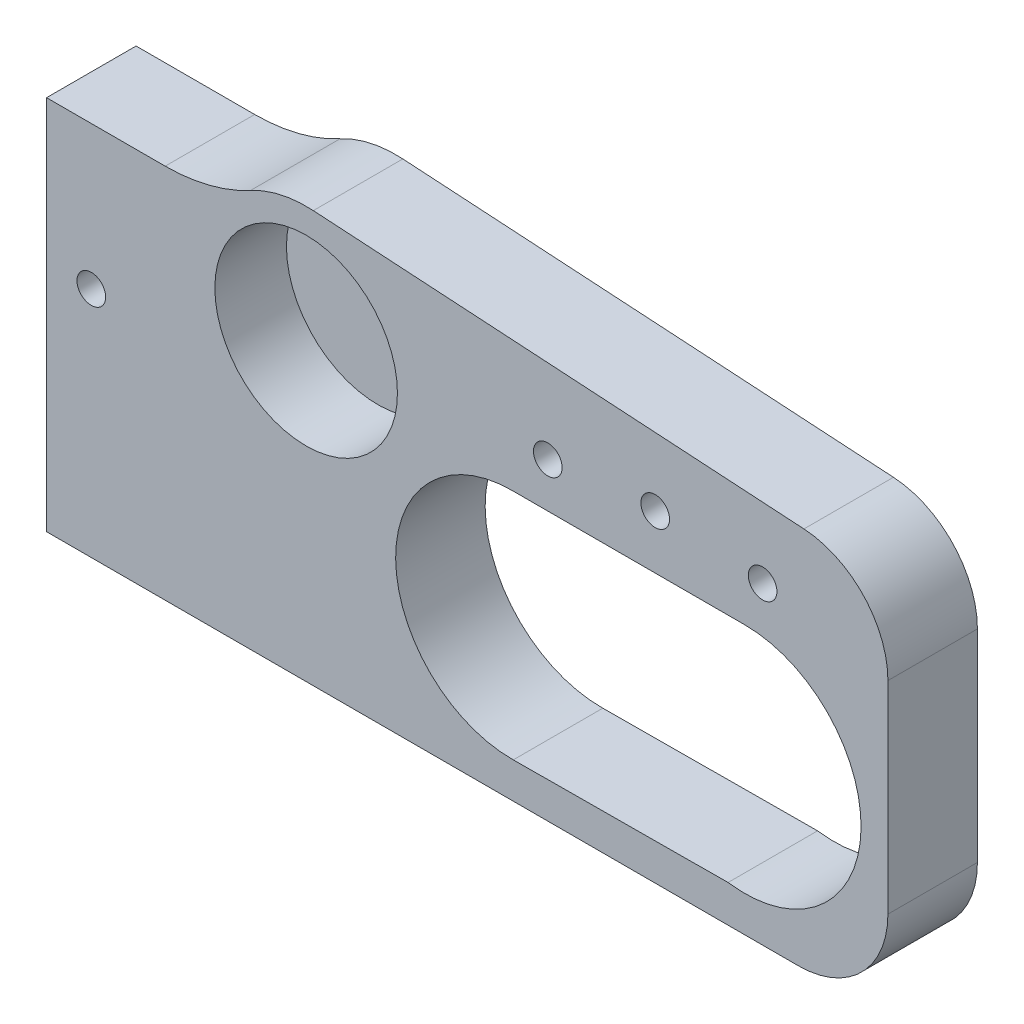
ISO-10303-21;
HEADER;
FILE_DESCRIPTION(('STEP AP214'),'2;1');
FILE_NAME('part.step','',(''),(''),'','','');
FILE_SCHEMA(('AUTOMOTIVE_DESIGN { 1 0 10303 214 1 1 1 1 }'));
ENDSEC;
DATA;
#1=APPLICATION_CONTEXT('core data for automotive mechanical design processes');
#2=APPLICATION_PROTOCOL_DEFINITION('international standard','automotive_design',2000,#1);
#3=PRODUCT_CONTEXT('',#1,'mechanical');
#4=PRODUCT('Part','Part','',(#3));
#5=PRODUCT_RELATED_PRODUCT_CATEGORY('part','',(#4));
#6=PRODUCT_DEFINITION_FORMATION('','',#4);
#7=PRODUCT_DEFINITION_CONTEXT('part definition',#1,'design');
#8=PRODUCT_DEFINITION('design','',#6,#7);
#9=PRODUCT_DEFINITION_SHAPE('','',#8);
#10=(LENGTH_UNIT() NAMED_UNIT(*) SI_UNIT(.MILLI.,.METRE.));
#11=(NAMED_UNIT(*) PLANE_ANGLE_UNIT() SI_UNIT($,.RADIAN.));
#12=(NAMED_UNIT(*) SI_UNIT($,.STERADIAN.) SOLID_ANGLE_UNIT());
#13=UNCERTAINTY_MEASURE_WITH_UNIT(LENGTH_MEASURE(1.E-05),#10,'distance_accuracy_value','');
#14=(GEOMETRIC_REPRESENTATION_CONTEXT(3) GLOBAL_UNCERTAINTY_ASSIGNED_CONTEXT((#13)) GLOBAL_UNIT_ASSIGNED_CONTEXT((#10,
#11,#12)) REPRESENTATION_CONTEXT('',''));
#15=CARTESIAN_POINT('',(0.,0.,0.));
#16=DIRECTION('',(0.,0.,1.));
#17=DIRECTION('',(1.,0.,0.));
#18=AXIS2_PLACEMENT_3D('',#15,#16,#17);
#19=CARTESIAN_POINT('',(-9.43815787852776,8.12368424294449,5.));
#20=DIRECTION('',(0.,0.,-1.));
#21=DIRECTION('',(-1.,0.,0.));
#22=AXIS2_PLACEMENT_3D('',#19,#20,#21);
#23=CYLINDRICAL_SURFACE('',#22,5.1);
#24=CARTESIAN_POINT('',(-9.43815787852776,8.12368424294449,5.));
#25=DIRECTION('',(0.,0.,1.));
#26=DIRECTION('',(1.,0.,0.));
#27=AXIS2_PLACEMENT_3D('',#24,#25,#26);
#28=CIRCLE('',#27,5.1);
#29=CARTESIAN_POINT('',(-4.33815787852776,8.12368424294449,5.));
#30=VERTEX_POINT('',#29);
#31=EDGE_CURVE('E224',#30,#30,#28,.T.);
#32=ORIENTED_EDGE('',*,*,#31,.T.);
#33=EDGE_LOOP('',(#32));
#34=FACE_BOUND('',#33,.T.);
#35=CARTESIAN_POINT('',(-9.43815787852776,8.12368424294449,1.));
#36=DIRECTION('',(0.,0.,-1.));
#37=DIRECTION('',(-1.,0.,0.));
#38=AXIS2_PLACEMENT_3D('',#35,#36,#37);
#39=CIRCLE('',#38,5.1);
#40=CARTESIAN_POINT('',(-14.5381578785278,8.12368424294449,1.));
#41=VERTEX_POINT('',#40);
#42=EDGE_CURVE('E323',#41,#41,#39,.T.);
#43=ORIENTED_EDGE('',*,*,#42,.T.);
#44=EDGE_LOOP('',(#43));
#45=FACE_BOUND('',#44,.T.);
#46=ADVANCED_FACE('F41',(#34,#45),#23,.F.);
#47=CARTESIAN_POINT('',(23.0618421214722,0.,5.));
#48=DIRECTION('',(1.,0.,0.));
#49=DIRECTION('',(0.,0.,-1.));
#50=AXIS2_PLACEMENT_3D('',#47,#48,#49);
#51=PLANE('',#50);
#52=DIRECTION('',(0.,-1.,0.));
#53=VECTOR('',#52,1.);
#54=CARTESIAN_POINT('',(23.0618421214722,0.,0.));
#55=LINE('',#54,#53);
#56=CARTESIAN_POINT('',(23.0618421214722,7.92371533758916,0.));
#57=VERTEX_POINT('',#56);
#58=CARTESIAN_POINT('',(23.0618421214722,-3.37631575705552,0.));
#59=VERTEX_POINT('',#58);
#60=EDGE_CURVE('E199',#57,#59,#55,.T.);
#61=ORIENTED_EDGE('',*,*,#60,.F.);
#62=DIRECTION('',(0.,0.,-1.));
#63=VECTOR('',#62,1.);
#64=CARTESIAN_POINT('',(23.0618421214722,7.92371533758916,5.));
#65=LINE('',#64,#63);
#66=CARTESIAN_POINT('',(23.0618421214722,7.92371533758916,5.));
#67=VERTEX_POINT('',#66);
#68=EDGE_CURVE('E11',#67,#57,#65,.T.);
#69=ORIENTED_EDGE('',*,*,#68,.F.);
#70=DIRECTION('',(0.,-1.,0.));
#71=VECTOR('',#70,1.);
#72=CARTESIAN_POINT('',(23.0618421214722,0.,5.));
#73=LINE('',#72,#71);
#74=CARTESIAN_POINT('',(23.0618421214722,-3.37631575705552,5.));
#75=VERTEX_POINT('',#74);
#76=EDGE_CURVE('E277',#67,#75,#73,.T.);
#77=ORIENTED_EDGE('',*,*,#76,.T.);
#78=DIRECTION('',(0.,0.,-1.));
#79=VECTOR('',#78,1.);
#80=CARTESIAN_POINT('',(23.0618421214722,-3.37631575705552,5.));
#81=LINE('',#80,#79);
#82=EDGE_CURVE('E107',#75,#59,#81,.T.);
#83=ORIENTED_EDGE('',*,*,#82,.T.);
#84=EDGE_LOOP('',(#61,#69,#77,#83));
#85=FACE_BOUND('',#84,.T.);
#86=ADVANCED_FACE('F311',(#85),#51,.T.);
#87=CARTESIAN_POINT('',(18.0618421214722,7.9237153375891,5.));
#88=DIRECTION('',(0.,0.,-1.));
#89=DIRECTION('',(-1.,0.,0.));
#90=AXIS2_PLACEMENT_3D('',#87,#88,#89);
#91=CYLINDRICAL_SURFACE('',#90,5.);
#92=CARTESIAN_POINT('',(18.0618421214722,7.9237153375891,0.));
#93=DIRECTION('',(0.,0.,1.));
#94=DIRECTION('',(1.,0.,0.));
#95=AXIS2_PLACEMENT_3D('',#92,#93,#94);
#96=CIRCLE('',#95,5.);
#97=CARTESIAN_POINT('',(18.3708578735485,12.9141571281492,0.));
#98=VERTEX_POINT('',#97);
#99=EDGE_CURVE('E201',#57,#98,#96,.T.);
#100=ORIENTED_EDGE('',*,*,#99,.T.);
#101=DIRECTION('',(0.,0.,-1.));
#102=VECTOR('',#101,1.);
#103=CARTESIAN_POINT('',(18.3708578735485,12.9141571281492,5.));
#104=LINE('',#103,#102);
#105=CARTESIAN_POINT('',(18.3708578735485,12.9141571281492,5.));
#106=VERTEX_POINT('',#105);
#107=EDGE_CURVE('E49',#106,#98,#104,.T.);
#108=ORIENTED_EDGE('',*,*,#107,.F.);
#109=CARTESIAN_POINT('',(18.0618421214722,7.9237153375891,5.));
#110=DIRECTION('',(0.,0.,1.));
#111=DIRECTION('',(1.,0.,0.));
#112=AXIS2_PLACEMENT_3D('',#109,#110,#111);
#113=CIRCLE('',#112,5.);
#114=EDGE_CURVE('E278',#67,#106,#113,.T.);
#115=ORIENTED_EDGE('',*,*,#114,.F.);
#116=ORIENTED_EDGE('',*,*,#68,.T.);
#117=EDGE_LOOP('',(#100,#108,#115,#116));
#118=FACE_BOUND('',#117,.T.);
#119=ADVANCED_FACE('F320',(#118),#91,.T.);
#120=CARTESIAN_POINT('',(0.866779714900697,13.9980362922802,5.));
#121=DIRECTION('',(-0.0618031504152585,-0.998088358112021,0.));
#122=DIRECTION('',(0.998088358112021,-0.0618031504152585,0.));
#123=AXIS2_PLACEMENT_3D('',#120,#121,#122);
#124=PLANE('',#123);
#125=DIRECTION('',(-0.998088358112021,0.0618031504152585,0.));
#126=VECTOR('',#125,1.);
#127=CARTESIAN_POINT('',(0.866779714900697,13.9980362922802,0.));
#128=LINE('',#127,#126);
#129=CARTESIAN_POINT('',(-9.03643740082861,14.6112585706726,0.));
#130=VERTEX_POINT('',#129);
#131=EDGE_CURVE('E202',#98,#130,#128,.T.);
#132=ORIENTED_EDGE('',*,*,#131,.T.);
#133=DIRECTION('',(0.,0.,-1.));
#134=VECTOR('',#133,1.);
#135=CARTESIAN_POINT('',(-9.03643740082861,14.6112585706726,5.));
#136=LINE('',#135,#134);
#137=CARTESIAN_POINT('',(-9.03643740082861,14.6112585706726,5.));
#138=VERTEX_POINT('',#137);
#139=EDGE_CURVE('E230',#138,#130,#136,.T.);
#140=ORIENTED_EDGE('',*,*,#139,.F.);
#141=DIRECTION('',(-0.998088358112021,0.0618031504152585,0.));
#142=VECTOR('',#141,1.);
#143=CARTESIAN_POINT('',(0.866779714900697,13.9980362922802,5.));
#144=LINE('',#143,#142);
#145=EDGE_CURVE('E285',#106,#138,#144,.T.);
#146=ORIENTED_EDGE('',*,*,#145,.F.);
#147=ORIENTED_EDGE('',*,*,#107,.T.);
#148=EDGE_LOOP('',(#132,#140,#146,#147));
#149=FACE_BOUND('',#148,.T.);
#150=ADVANCED_FACE('F359',(#149),#124,.F.);
#151=CARTESIAN_POINT('',(-9.43815787852776,8.12368424294449,5.));
#152=DIRECTION('',(0.,0.,-1.));
#153=DIRECTION('',(-1.,0.,0.));
#154=AXIS2_PLACEMENT_3D('',#151,#152,#153);
#155=CYLINDRICAL_SURFACE('',#154,6.49999999999999);
#156=CARTESIAN_POINT('',(-9.43815787852776,8.12368424294449,0.));
#157=DIRECTION('',(0.,0.,1.));
#158=DIRECTION('',(1.,0.,0.));
#159=AXIS2_PLACEMENT_3D('',#156,#157,#158);
#160=CIRCLE('',#159,6.49999999999999);
#161=CARTESIAN_POINT('',(-12.54003976829,13.8358054550657,0.));
#162=VERTEX_POINT('',#161);
#163=EDGE_CURVE('E206',#130,#162,#160,.T.);
#164=ORIENTED_EDGE('',*,*,#163,.T.);
#165=DIRECTION('',(0.,0.,-1.));
#166=VECTOR('',#165,1.);
#167=CARTESIAN_POINT('',(-12.54003976829,13.8358054550657,5.));
#168=LINE('',#167,#166);
#169=CARTESIAN_POINT('',(-12.54003976829,13.8358054550657,5.));
#170=VERTEX_POINT('',#169);
#171=EDGE_CURVE('E227',#170,#162,#168,.T.);
#172=ORIENTED_EDGE('',*,*,#171,.F.);
#173=CARTESIAN_POINT('',(-9.43815787852776,8.12368424294449,5.));
#174=DIRECTION('',(0.,0.,1.));
#175=DIRECTION('',(1.,0.,0.));
#176=AXIS2_PLACEMENT_3D('',#173,#174,#175);
#177=CIRCLE('',#176,6.49999999999999);
#178=EDGE_CURVE('E284',#138,#170,#177,.T.);
#179=ORIENTED_EDGE('',*,*,#178,.F.);
#180=ORIENTED_EDGE('',*,*,#139,.T.);
#181=EDGE_LOOP('',(#164,#172,#179,#180));
#182=FACE_BOUND('',#181,.T.);
#183=ADVANCED_FACE('F357',(#182),#155,.T.);
#184=CARTESIAN_POINT('',(-17.3121657525396,22.6236842429445,5.));
#185=DIRECTION('',(0.,0.,-1.));
#186=DIRECTION('',(-1.,0.,0.));
#187=AXIS2_PLACEMENT_3D('',#184,#185,#186);
#188=CYLINDRICAL_SURFACE('',#187,10.);
#189=CARTESIAN_POINT('',(-17.3121657525396,22.6236842429445,0.));
#190=DIRECTION('',(0.,0.,1.));
#191=DIRECTION('',(1.,0.,0.));
#192=AXIS2_PLACEMENT_3D('',#189,#190,#191);
#193=CIRCLE('',#192,10.);
#194=CARTESIAN_POINT('',(-17.3121657525395,12.6236842429445,0.));
#195=VERTEX_POINT('',#194);
#196=EDGE_CURVE('E211',#195,#162,#193,.T.);
#197=ORIENTED_EDGE('',*,*,#196,.F.);
#198=DIRECTION('',(0.,0.,-1.));
#199=VECTOR('',#198,1.);
#200=CARTESIAN_POINT('',(-17.3121657525395,12.6236842429445,5.));
#201=LINE('',#200,#199);
#202=CARTESIAN_POINT('',(-17.3121657525395,12.6236842429445,5.));
#203=VERTEX_POINT('',#202);
#204=EDGE_CURVE('E222',#203,#195,#201,.T.);
#205=ORIENTED_EDGE('',*,*,#204,.F.);
#206=CARTESIAN_POINT('',(-17.3121657525396,22.6236842429445,5.));
#207=DIRECTION('',(0.,0.,1.));
#208=DIRECTION('',(1.,0.,0.));
#209=AXIS2_PLACEMENT_3D('',#206,#207,#208);
#210=CIRCLE('',#209,10.);
#211=EDGE_CURVE('E169',#203,#170,#210,.T.);
#212=ORIENTED_EDGE('',*,*,#211,.T.);
#213=ORIENTED_EDGE('',*,*,#171,.T.);
#214=EDGE_LOOP('',(#197,#205,#212,#213));
#215=FACE_BOUND('',#214,.T.);
#216=ADVANCED_FACE('F288',(#215),#188,.F.);
#217=CARTESIAN_POINT('',(0.,12.6236842429445,5.));
#218=DIRECTION('',(0.,1.,0.));
#219=DIRECTION('',(-1.,0.,0.));
#220=AXIS2_PLACEMENT_3D('',#217,#218,#219);
#221=PLANE('',#220);
#222=DIRECTION('',(1.,0.,0.));
#223=VECTOR('',#222,1.);
#224=CARTESIAN_POINT('',(0.,12.6236842429445,0.));
#225=LINE('',#224,#223);
#226=CARTESIAN_POINT('',(-23.9381578785278,12.6236842429445,0.));
#227=VERTEX_POINT('',#226);
#228=EDGE_CURVE('E213',#227,#195,#225,.T.);
#229=ORIENTED_EDGE('',*,*,#228,.F.);
#230=DIRECTION('',(0.,0.,-1.));
#231=VECTOR('',#230,1.);
#232=CARTESIAN_POINT('',(-23.9381578785278,12.6236842429445,5.));
#233=LINE('',#232,#231);
#234=CARTESIAN_POINT('',(-23.9381578785278,12.6236842429445,5.));
#235=VERTEX_POINT('',#234);
#236=EDGE_CURVE('E159',#235,#227,#233,.T.);
#237=ORIENTED_EDGE('',*,*,#236,.F.);
#238=DIRECTION('',(1.,0.,0.));
#239=VECTOR('',#238,1.);
#240=CARTESIAN_POINT('',(0.,12.6236842429445,5.));
#241=LINE('',#240,#239);
#242=EDGE_CURVE('E170',#235,#203,#241,.T.);
#243=ORIENTED_EDGE('',*,*,#242,.T.);
#244=ORIENTED_EDGE('',*,*,#204,.T.);
#245=EDGE_LOOP('',(#229,#237,#243,#244));
#246=FACE_BOUND('',#245,.T.);
#247=ADVANCED_FACE('F291',(#246),#221,.T.);
#248=CARTESIAN_POINT('',(-23.9381578785278,0.,5.));
#249=DIRECTION('',(-1.,0.,0.));
#250=DIRECTION('',(0.,0.,1.));
#251=AXIS2_PLACEMENT_3D('',#248,#249,#250);
#252=PLANE('',#251);
#253=CARTESIAN_POINT('',(-23.9381578785278,9.62368424294448,2.5));
#254=DIRECTION('',(-1.,0.,0.));
#255=DIRECTION('',(0.,0.,1.));
#256=AXIS2_PLACEMENT_3D('',#253,#254,#255);
#257=CIRCLE('',#256,1.25);
#258=CARTESIAN_POINT('',(-23.9381578785278,9.62368424294448,3.75));
#259=VERTEX_POINT('',#258);
#260=EDGE_CURVE('E333',#259,#259,#257,.T.);
#261=ORIENTED_EDGE('',*,*,#260,.F.);
#262=EDGE_LOOP('',(#261));
#263=FACE_BOUND('',#262,.T.);
#264=CARTESIAN_POINT('',(-23.9381578785278,-5.37631575705552,2.5));
#265=DIRECTION('',(-1.,0.,0.));
#266=DIRECTION('',(0.,0.,1.));
#267=AXIS2_PLACEMENT_3D('',#264,#265,#266);
#268=CIRCLE('',#267,1.25);
#269=CARTESIAN_POINT('',(-23.9381578785278,-5.37631575705552,3.75));
#270=VERTEX_POINT('',#269);
#271=EDGE_CURVE('E327',#270,#270,#268,.T.);
#272=ORIENTED_EDGE('',*,*,#271,.F.);
#273=EDGE_LOOP('',(#272));
#274=FACE_BOUND('',#273,.T.);
#275=DIRECTION('',(0.,1.,0.));
#276=VECTOR('',#275,1.);
#277=CARTESIAN_POINT('',(-23.9381578785278,0.,0.));
#278=LINE('',#277,#276);
#279=CARTESIAN_POINT('',(-23.9381578785278,-8.37631575705552,0.));
#280=VERTEX_POINT('',#279);
#281=EDGE_CURVE('E153',#280,#227,#278,.T.);
#282=ORIENTED_EDGE('',*,*,#281,.F.);
#283=DIRECTION('',(0.,0.,-1.));
#284=VECTOR('',#283,1.);
#285=CARTESIAN_POINT('',(-23.9381578785278,-8.37631575705552,5.));
#286=LINE('',#285,#284);
#287=CARTESIAN_POINT('',(-23.9381578785278,-8.37631575705552,5.));
#288=VERTEX_POINT('',#287);
#289=EDGE_CURVE('E147',#288,#280,#286,.T.);
#290=ORIENTED_EDGE('',*,*,#289,.F.);
#291=DIRECTION('',(0.,1.,0.));
#292=VECTOR('',#291,1.);
#293=CARTESIAN_POINT('',(-23.9381578785278,0.,5.));
#294=LINE('',#293,#292);
#295=EDGE_CURVE('E151',#288,#235,#294,.T.);
#296=ORIENTED_EDGE('',*,*,#295,.T.);
#297=ORIENTED_EDGE('',*,*,#236,.T.);
#298=EDGE_LOOP('',(#282,#290,#296,#297));
#299=FACE_BOUND('',#298,.T.);
#300=ADVANCED_FACE('F148',(#263,#274,#299),#252,.T.);
#301=CARTESIAN_POINT('',(0.,-8.37631575705552,5.));
#302=DIRECTION('',(0.,1.,0.));
#303=DIRECTION('',(-1.,0.,0.));
#304=AXIS2_PLACEMENT_3D('',#301,#302,#303);
#305=PLANE('',#304);
#306=DIRECTION('',(1.,0.,0.));
#307=VECTOR('',#306,1.);
#308=CARTESIAN_POINT('',(0.,-8.37631575705552,0.));
#309=LINE('',#308,#307);
#310=CARTESIAN_POINT('',(18.0618421214723,-8.37631575705552,0.));
#311=VERTEX_POINT('',#310);
#312=EDGE_CURVE('E218',#280,#311,#309,.T.);
#313=ORIENTED_EDGE('',*,*,#312,.T.);
#314=DIRECTION('',(0.,0.,-1.));
#315=VECTOR('',#314,1.);
#316=CARTESIAN_POINT('',(18.0618421214723,-8.37631575705552,5.));
#317=LINE('',#316,#315);
#318=CARTESIAN_POINT('',(18.0618421214723,-8.37631575705552,5.));
#319=VERTEX_POINT('',#318);
#320=EDGE_CURVE('E156',#319,#311,#317,.T.);
#321=ORIENTED_EDGE('',*,*,#320,.F.);
#322=DIRECTION('',(1.,0.,0.));
#323=VECTOR('',#322,1.);
#324=CARTESIAN_POINT('',(0.,-8.37631575705552,5.));
#325=LINE('',#324,#323);
#326=EDGE_CURVE('E157',#288,#319,#325,.T.);
#327=ORIENTED_EDGE('',*,*,#326,.F.);
#328=ORIENTED_EDGE('',*,*,#289,.T.);
#329=EDGE_LOOP('',(#313,#321,#327,#328));
#330=FACE_BOUND('',#329,.T.);
#331=ADVANCED_FACE('F163',(#330),#305,.F.);
#332=CARTESIAN_POINT('',(15.0618421214712,0.123684242944485,5.));
#333=DIRECTION('',(0.,0.,-1.));
#334=DIRECTION('',(-1.,0.,0.));
#335=AXIS2_PLACEMENT_3D('',#332,#333,#334);
#336=CYLINDRICAL_SURFACE('',#335,6.5);
#337=CARTESIAN_POINT('',(15.0618421214712,0.123684242944485,0.));
#338=DIRECTION('',(0.,0.,1.));
#339=DIRECTION('',(1.,0.,0.));
#340=AXIS2_PLACEMENT_3D('',#337,#338,#339);
#341=CIRCLE('',#340,6.5);
#342=CARTESIAN_POINT('',(14.1329018950054,-6.30959408584354,0.));
#343=VERTEX_POINT('',#342);
#344=CARTESIAN_POINT('',(15.0618421214722,6.62368424294448,0.));
#345=VERTEX_POINT('',#344);
#346=EDGE_CURVE('E174',#343,#345,#341,.T.);
#347=ORIENTED_EDGE('',*,*,#346,.F.);
#348=DIRECTION('',(0.,0.,-1.));
#349=VECTOR('',#348,1.);
#350=CARTESIAN_POINT('',(14.1329018950054,-6.30959408584354,5.));
#351=LINE('',#350,#349);
#352=CARTESIAN_POINT('',(14.1329018950054,-6.30959408584354,5.));
#353=VERTEX_POINT('',#352);
#354=EDGE_CURVE('E42',#353,#343,#351,.T.);
#355=ORIENTED_EDGE('',*,*,#354,.F.);
#356=CARTESIAN_POINT('',(15.0618421214712,0.123684242944485,5.));
#357=DIRECTION('',(0.,0.,1.));
#358=DIRECTION('',(1.,0.,0.));
#359=AXIS2_PLACEMENT_3D('',#356,#357,#358);
#360=CIRCLE('',#359,6.5);
#361=CARTESIAN_POINT('',(15.0618421214722,6.62368424294448,5.));
#362=VERTEX_POINT('',#361);
#363=EDGE_CURVE('E338',#353,#362,#360,.T.);
#364=ORIENTED_EDGE('',*,*,#363,.T.);
#365=DIRECTION('',(0.,0.,-1.));
#366=VECTOR('',#365,1.);
#367=CARTESIAN_POINT('',(15.0618421214722,6.62368424294448,5.));
#368=LINE('',#367,#366);
#369=EDGE_CURVE('E172',#362,#345,#368,.T.);
#370=ORIENTED_EDGE('',*,*,#369,.T.);
#371=EDGE_LOOP('',(#347,#355,#364,#370));
#372=FACE_BOUND('',#371,.T.);
#373=ADVANCED_FACE('F246',(#372),#336,.F.);
#374=CARTESIAN_POINT('',(0.035306413320846,-6.38751724654818,5.));
#375=DIRECTION('',(-0.00552732346942933,0.999984724230958,0.));
#376=DIRECTION('',(-0.999984724230958,-0.00552732346942933,0.));
#377=AXIS2_PLACEMENT_3D('',#374,#375,#376);
#378=PLANE('',#377);
#379=DIRECTION('',(0.999984724230958,0.00552732346942933,0.));
#380=VECTOR('',#379,1.);
#381=CARTESIAN_POINT('',(0.035306413320846,-6.38751724654818,0.));
#382=LINE('',#381,#380);
#383=CARTESIAN_POINT('',(2.13369622893157,-6.37591859009395,0.));
#384=VERTEX_POINT('',#383);
#385=EDGE_CURVE('E178',#384,#343,#382,.T.);
#386=ORIENTED_EDGE('',*,*,#385,.F.);
#387=DIRECTION('',(0.,0.,-1.));
#388=VECTOR('',#387,1.);
#389=CARTESIAN_POINT('',(2.13369622893157,-6.37591859009395,5.));
#390=LINE('',#389,#388);
#391=CARTESIAN_POINT('',(2.13369622893157,-6.37591859009395,5.));
#392=VERTEX_POINT('',#391);
#393=EDGE_CURVE('E236',#392,#384,#390,.T.);
#394=ORIENTED_EDGE('',*,*,#393,.F.);
#395=DIRECTION('',(0.999984724230958,0.00552732346942933,0.));
#396=VECTOR('',#395,1.);
#397=CARTESIAN_POINT('',(0.035306413320846,-6.38751724654818,5.));
#398=LINE('',#397,#396);
#399=EDGE_CURVE('E244',#392,#353,#398,.T.);
#400=ORIENTED_EDGE('',*,*,#399,.T.);
#401=ORIENTED_EDGE('',*,*,#354,.T.);
#402=EDGE_LOOP('',(#386,#394,#400,#401));
#403=FACE_BOUND('',#402,.T.);
#404=ADVANCED_FACE('F243',(#403),#378,.T.);
#405=CARTESIAN_POINT('',(2.06184212147224,0.123684242944485,5.));
#406=DIRECTION('',(0.,0.,-1.));
#407=DIRECTION('',(-1.,0.,0.));
#408=AXIS2_PLACEMENT_3D('',#405,#406,#407);
#409=CYLINDRICAL_SURFACE('',#408,6.5);
#410=CARTESIAN_POINT('',(2.06184212147224,0.123684242944485,0.));
#411=DIRECTION('',(0.,0.,1.));
#412=DIRECTION('',(1.,0.,0.));
#413=AXIS2_PLACEMENT_3D('',#410,#411,#412);
#414=CIRCLE('',#413,6.5);
#415=CARTESIAN_POINT('',(2.06184212147224,6.62368424294448,0.));
#416=VERTEX_POINT('',#415);
#417=EDGE_CURVE('E185',#416,#384,#414,.T.);
#418=ORIENTED_EDGE('',*,*,#417,.F.);
#419=DIRECTION('',(0.,0.,-1.));
#420=VECTOR('',#419,1.);
#421=CARTESIAN_POINT('',(2.06184212147224,6.62368424294448,5.));
#422=LINE('',#421,#420);
#423=CARTESIAN_POINT('',(2.06184212147224,6.62368424294448,5.));
#424=VERTEX_POINT('',#423);
#425=EDGE_CURVE('E232',#424,#416,#422,.T.);
#426=ORIENTED_EDGE('',*,*,#425,.F.);
#427=CARTESIAN_POINT('',(2.06184212147224,0.123684242944485,5.));
#428=DIRECTION('',(0.,0.,1.));
#429=DIRECTION('',(1.,0.,0.));
#430=AXIS2_PLACEMENT_3D('',#427,#428,#429);
#431=CIRCLE('',#430,6.5);
#432=EDGE_CURVE('E254',#424,#392,#431,.T.);
#433=ORIENTED_EDGE('',*,*,#432,.T.);
#434=ORIENTED_EDGE('',*,*,#393,.T.);
#435=EDGE_LOOP('',(#418,#426,#433,#434));
#436=FACE_BOUND('',#435,.T.);
#437=ADVANCED_FACE('F252',(#436),#409,.F.);
#438=CARTESIAN_POINT('',(-21.4381578785278,4.62368424294448,5.));
#439=DIRECTION('',(0.,0.,-1.));
#440=DIRECTION('',(-1.,0.,0.));
#441=AXIS2_PLACEMENT_3D('',#438,#439,#440);
#442=CYLINDRICAL_SURFACE('',#441,0.8);
#443=CARTESIAN_POINT('',(-21.4381578785278,4.62368424294448,5.));
#444=DIRECTION('',(0.,0.,1.));
#445=DIRECTION('',(1.,0.,0.));
#446=AXIS2_PLACEMENT_3D('',#443,#444,#445);
#447=CIRCLE('',#446,0.8);
#448=CARTESIAN_POINT('',(-20.6381578785278,4.62368424294448,5.));
#449=VERTEX_POINT('',#448);
#450=EDGE_CURVE('E274',#449,#449,#447,.T.);
#451=ORIENTED_EDGE('',*,*,#450,.T.);
#452=EDGE_LOOP('',(#451));
#453=FACE_BOUND('',#452,.T.);
#454=CARTESIAN_POINT('',(-21.4381578785278,4.62368424294448,0.));
#455=DIRECTION('',(0.,0.,1.));
#456=DIRECTION('',(1.,0.,0.));
#457=AXIS2_PLACEMENT_3D('',#454,#455,#456);
#458=CIRCLE('',#457,0.8);
#459=CARTESIAN_POINT('',(-20.6381578785278,4.62368424294448,0.));
#460=VERTEX_POINT('',#459);
#461=EDGE_CURVE('E200',#460,#460,#458,.T.);
#462=ORIENTED_EDGE('',*,*,#461,.F.);
#463=EDGE_LOOP('',(#462));
#464=FACE_BOUND('',#463,.T.);
#465=ADVANCED_FACE('F368',(#453,#464),#442,.F.);
#466=CARTESIAN_POINT('',(4.06184212147224,9.12368424294448,5.));
#467=DIRECTION('',(0.,0.,-1.));
#468=DIRECTION('',(-1.,0.,0.));
#469=AXIS2_PLACEMENT_3D('',#466,#467,#468);
#470=CYLINDRICAL_SURFACE('',#469,0.800000000000001);
#471=CARTESIAN_POINT('',(4.06184212147224,9.12368424294448,5.));
#472=DIRECTION('',(0.,0.,1.));
#473=DIRECTION('',(1.,0.,0.));
#474=AXIS2_PLACEMENT_3D('',#471,#472,#473);
#475=CIRCLE('',#474,0.800000000000001);
#476=CARTESIAN_POINT('',(4.86184212147224,9.12368424294448,5.));
#477=VERTEX_POINT('',#476);
#478=EDGE_CURVE('E272',#477,#477,#475,.T.);
#479=ORIENTED_EDGE('',*,*,#478,.T.);
#480=EDGE_LOOP('',(#479));
#481=FACE_BOUND('',#480,.T.);
#482=CARTESIAN_POINT('',(4.06184212147224,9.12368424294448,0.));
#483=DIRECTION('',(0.,0.,1.));
#484=DIRECTION('',(1.,0.,0.));
#485=AXIS2_PLACEMENT_3D('',#482,#483,#484);
#486=CIRCLE('',#485,0.800000000000001);
#487=CARTESIAN_POINT('',(4.86184212147224,9.12368424294448,0.));
#488=VERTEX_POINT('',#487);
#489=EDGE_CURVE('E193',#488,#488,#486,.T.);
#490=ORIENTED_EDGE('',*,*,#489,.F.);
#491=EDGE_LOOP('',(#490));
#492=FACE_BOUND('',#491,.T.);
#493=ADVANCED_FACE('F371',(#481,#492),#470,.F.);
#494=CARTESIAN_POINT('',(10.0618421214722,9.62368424294448,5.));
#495=DIRECTION('',(0.,0.,-1.));
#496=DIRECTION('',(-1.,0.,0.));
#497=AXIS2_PLACEMENT_3D('',#494,#495,#496);
#498=CYLINDRICAL_SURFACE('',#497,0.800000000000002);
#499=CARTESIAN_POINT('',(10.0618421214722,9.62368424294448,5.));
#500=DIRECTION('',(0.,0.,1.));
#501=DIRECTION('',(1.,0.,0.));
#502=AXIS2_PLACEMENT_3D('',#499,#500,#501);
#503=CIRCLE('',#502,0.800000000000002);
#504=CARTESIAN_POINT('',(10.8618421214722,9.62368424294448,5.));
#505=VERTEX_POINT('',#504);
#506=EDGE_CURVE('E264',#505,#505,#503,.T.);
#507=ORIENTED_EDGE('',*,*,#506,.T.);
#508=EDGE_LOOP('',(#507));
#509=FACE_BOUND('',#508,.T.);
#510=CARTESIAN_POINT('',(10.0618421214722,9.62368424294448,0.));
#511=DIRECTION('',(0.,0.,1.));
#512=DIRECTION('',(1.,0.,0.));
#513=AXIS2_PLACEMENT_3D('',#510,#511,#512);
#514=CIRCLE('',#513,0.800000000000002);
#515=CARTESIAN_POINT('',(10.8618421214722,9.62368424294448,0.));
#516=VERTEX_POINT('',#515);
#517=EDGE_CURVE('E191',#516,#516,#514,.T.);
#518=ORIENTED_EDGE('',*,*,#517,.F.);
#519=EDGE_LOOP('',(#518));
#520=FACE_BOUND('',#519,.T.);
#521=ADVANCED_FACE('F374',(#509,#520),#498,.F.);
#522=CARTESIAN_POINT('',(16.0618421214722,9.12368424294448,5.));
#523=DIRECTION('',(0.,0.,-1.));
#524=DIRECTION('',(-1.,0.,0.));
#525=AXIS2_PLACEMENT_3D('',#522,#523,#524);
#526=CYLINDRICAL_SURFACE('',#525,0.8);
#527=CARTESIAN_POINT('',(16.0618421214722,9.12368424294448,5.));
#528=DIRECTION('',(0.,0.,1.));
#529=DIRECTION('',(1.,0.,0.));
#530=AXIS2_PLACEMENT_3D('',#527,#528,#529);
#531=CIRCLE('',#530,0.8);
#532=CARTESIAN_POINT('',(16.8618421214722,9.12368424294448,5.));
#533=VERTEX_POINT('',#532);
#534=EDGE_CURVE('E265',#533,#533,#531,.T.);
#535=ORIENTED_EDGE('',*,*,#534,.T.);
#536=EDGE_LOOP('',(#535));
#537=FACE_BOUND('',#536,.T.);
#538=CARTESIAN_POINT('',(16.0618421214722,9.12368424294448,0.));
#539=DIRECTION('',(0.,0.,1.));
#540=DIRECTION('',(1.,0.,0.));
#541=AXIS2_PLACEMENT_3D('',#538,#539,#540);
#542=CIRCLE('',#541,0.8);
#543=CARTESIAN_POINT('',(16.8618421214722,9.12368424294448,0.));
#544=VERTEX_POINT('',#543);
#545=EDGE_CURVE('E189',#544,#544,#542,.T.);
#546=ORIENTED_EDGE('',*,*,#545,.F.);
#547=EDGE_LOOP('',(#546));
#548=FACE_BOUND('',#547,.T.);
#549=ADVANCED_FACE('F378',(#537,#548),#526,.F.);
#550=CARTESIAN_POINT('',(0.,6.62368424294448,5.));
#551=DIRECTION('',(0.,-1.,0.));
#552=DIRECTION('',(0.,0.,-1.));
#553=AXIS2_PLACEMENT_3D('',#550,#551,#552);
#554=PLANE('',#553);
#555=DIRECTION('',(-1.,0.,0.));
#556=VECTOR('',#555,1.);
#557=CARTESIAN_POINT('',(0.,6.62368424294448,0.));
#558=LINE('',#557,#556);
#559=EDGE_CURVE('E184',#345,#416,#558,.T.);
#560=ORIENTED_EDGE('',*,*,#559,.F.);
#561=ORIENTED_EDGE('',*,*,#369,.F.);
#562=DIRECTION('',(-1.,0.,0.));
#563=VECTOR('',#562,1.);
#564=CARTESIAN_POINT('',(0.,6.62368424294448,5.));
#565=LINE('',#564,#563);
#566=EDGE_CURVE('E258',#362,#424,#565,.T.);
#567=ORIENTED_EDGE('',*,*,#566,.T.);
#568=ORIENTED_EDGE('',*,*,#425,.T.);
#569=EDGE_LOOP('',(#560,#561,#567,#568));
#570=FACE_BOUND('',#569,.T.);
#571=ADVANCED_FACE('F261',(#570),#554,.T.);
#572=CARTESIAN_POINT('',(18.0618421214722,-3.37631575705552,5.));
#573=DIRECTION('',(0.,0.,-1.));
#574=DIRECTION('',(-1.,0.,0.));
#575=AXIS2_PLACEMENT_3D('',#572,#573,#574);
#576=CYLINDRICAL_SURFACE('',#575,5.);
#577=CARTESIAN_POINT('',(18.0618421214722,-3.37631575705552,0.));
#578=DIRECTION('',(0.,0.,1.));
#579=DIRECTION('',(1.,0.,0.));
#580=AXIS2_PLACEMENT_3D('',#577,#578,#579);
#581=CIRCLE('',#580,5.);
#582=EDGE_CURVE('E105',#311,#59,#581,.T.);
#583=ORIENTED_EDGE('',*,*,#582,.T.);
#584=ORIENTED_EDGE('',*,*,#82,.F.);
#585=CARTESIAN_POINT('',(18.0618421214722,-3.37631575705552,5.));
#586=DIRECTION('',(0.,0.,1.));
#587=DIRECTION('',(1.,0.,0.));
#588=AXIS2_PLACEMENT_3D('',#585,#586,#587);
#589=CIRCLE('',#588,5.);
#590=EDGE_CURVE('E56',#319,#75,#589,.T.);
#591=ORIENTED_EDGE('',*,*,#590,.F.);
#592=ORIENTED_EDGE('',*,*,#320,.T.);
#593=EDGE_LOOP('',(#583,#584,#591,#592));
#594=FACE_BOUND('',#593,.T.);
#595=ADVANCED_FACE('F310',(#594),#576,.T.);
#596=CARTESIAN_POINT('',(0.,0.,5.));
#597=DIRECTION('',(0.,0.,1.));
#598=DIRECTION('',(1.,0.,0.));
#599=AXIS2_PLACEMENT_3D('',#596,#597,#598);
#600=PLANE('',#599);
#601=ORIENTED_EDGE('',*,*,#31,.F.);
#602=EDGE_LOOP('',(#601));
#603=FACE_BOUND('',#602,.T.);
#604=ORIENTED_EDGE('',*,*,#363,.F.);
#605=ORIENTED_EDGE('',*,*,#399,.F.);
#606=ORIENTED_EDGE('',*,*,#432,.F.);
#607=ORIENTED_EDGE('',*,*,#566,.F.);
#608=EDGE_LOOP('',(#604,#605,#606,#607));
#609=FACE_BOUND('',#608,.T.);
#610=ORIENTED_EDGE('',*,*,#534,.F.);
#611=EDGE_LOOP('',(#610));
#612=FACE_BOUND('',#611,.T.);
#613=ORIENTED_EDGE('',*,*,#506,.F.);
#614=EDGE_LOOP('',(#613));
#615=FACE_BOUND('',#614,.T.);
#616=ORIENTED_EDGE('',*,*,#478,.F.);
#617=EDGE_LOOP('',(#616));
#618=FACE_BOUND('',#617,.T.);
#619=ORIENTED_EDGE('',*,*,#450,.F.);
#620=EDGE_LOOP('',(#619));
#621=FACE_BOUND('',#620,.T.);
#622=ORIENTED_EDGE('',*,*,#76,.F.);
#623=ORIENTED_EDGE('',*,*,#114,.T.);
#624=ORIENTED_EDGE('',*,*,#145,.T.);
#625=ORIENTED_EDGE('',*,*,#178,.T.);
#626=ORIENTED_EDGE('',*,*,#211,.F.);
#627=ORIENTED_EDGE('',*,*,#242,.F.);
#628=ORIENTED_EDGE('',*,*,#295,.F.);
#629=ORIENTED_EDGE('',*,*,#326,.T.);
#630=ORIENTED_EDGE('',*,*,#590,.T.);
#631=EDGE_LOOP('',(#622,#623,#624,#625,#626,#627,#628,#629,#630));
#632=FACE_BOUND('',#631,.T.);
#633=ADVANCED_FACE('F165',(#603,#609,#612,#615,#618,#621,#632),#600,.T.);
#634=CARTESIAN_POINT('',(0.,0.,0.));
#635=DIRECTION('',(0.,0.,1.));
#636=DIRECTION('',(1.,0.,0.));
#637=AXIS2_PLACEMENT_3D('',#634,#635,#636);
#638=PLANE('',#637);
#639=ORIENTED_EDGE('',*,*,#346,.T.);
#640=ORIENTED_EDGE('',*,*,#559,.T.);
#641=ORIENTED_EDGE('',*,*,#417,.T.);
#642=ORIENTED_EDGE('',*,*,#385,.T.);
#643=EDGE_LOOP('',(#639,#640,#641,#642));
#644=FACE_BOUND('',#643,.T.);
#645=ORIENTED_EDGE('',*,*,#545,.T.);
#646=EDGE_LOOP('',(#645));
#647=FACE_BOUND('',#646,.T.);
#648=ORIENTED_EDGE('',*,*,#517,.T.);
#649=EDGE_LOOP('',(#648));
#650=FACE_BOUND('',#649,.T.);
#651=ORIENTED_EDGE('',*,*,#489,.T.);
#652=EDGE_LOOP('',(#651));
#653=FACE_BOUND('',#652,.T.);
#654=ORIENTED_EDGE('',*,*,#461,.T.);
#655=EDGE_LOOP('',(#654));
#656=FACE_BOUND('',#655,.T.);
#657=ORIENTED_EDGE('',*,*,#60,.T.);
#658=ORIENTED_EDGE('',*,*,#582,.F.);
#659=ORIENTED_EDGE('',*,*,#312,.F.);
#660=ORIENTED_EDGE('',*,*,#281,.T.);
#661=ORIENTED_EDGE('',*,*,#228,.T.);
#662=ORIENTED_EDGE('',*,*,#196,.T.);
#663=ORIENTED_EDGE('',*,*,#163,.F.);
#664=ORIENTED_EDGE('',*,*,#131,.F.);
#665=ORIENTED_EDGE('',*,*,#99,.F.);
#666=EDGE_LOOP('',(#657,#658,#659,#660,#661,#662,#663,#664,#665));
#667=FACE_BOUND('',#666,.T.);
#668=ADVANCED_FACE('F248',(#644,#647,#650,#653,#656,#667),#638,.F.);
#669=CARTESIAN_POINT('',(-18.9381578785278,-5.37631575705552,2.5));
#670=DIRECTION('',(-1.,0.,0.));
#671=DIRECTION('',(0.,0.,1.));
#672=AXIS2_PLACEMENT_3D('',#669,#670,#671);
#673=CYLINDRICAL_SURFACE('',#672,1.25);
#674=CARTESIAN_POINT('',(-18.9381578785278,-5.37631575705552,2.5));
#675=DIRECTION('',(-1.,0.,0.));
#676=DIRECTION('',(0.,0.,1.));
#677=AXIS2_PLACEMENT_3D('',#674,#675,#676);
#678=CIRCLE('',#677,1.25);
#679=CARTESIAN_POINT('',(-18.9381578785278,-5.37631575705552,3.75));
#680=VERTEX_POINT('',#679);
#681=EDGE_CURVE('E326',#680,#680,#678,.T.);
#682=ORIENTED_EDGE('',*,*,#681,.F.);
#683=EDGE_LOOP('',(#682));
#684=FACE_BOUND('',#683,.T.);
#685=ORIENTED_EDGE('',*,*,#271,.T.);
#686=EDGE_LOOP('',(#685));
#687=FACE_BOUND('',#686,.T.);
#688=ADVANCED_FACE('F298',(#684,#687),#673,.F.);
#689=CARTESIAN_POINT('',(-18.9381578785278,-5.37631575705552,2.5));
#690=DIRECTION('',(-1.,0.,0.));
#691=DIRECTION('',(0.,0.,1.));
#692=AXIS2_PLACEMENT_3D('',#689,#690,#691);
#693=PLANE('',#692);
#694=ORIENTED_EDGE('',*,*,#681,.T.);
#695=EDGE_LOOP('',(#694));
#696=FACE_BOUND('',#695,.T.);
#697=ADVANCED_FACE('F303',(#696),#693,.T.);
#698=CARTESIAN_POINT('',(-18.9381578785278,9.62368424294448,2.5));
#699=DIRECTION('',(-1.,0.,0.));
#700=DIRECTION('',(0.,0.,1.));
#701=AXIS2_PLACEMENT_3D('',#698,#699,#700);
#702=CYLINDRICAL_SURFACE('',#701,1.25);
#703=CARTESIAN_POINT('',(-18.9381578785278,9.62368424294448,2.5));
#704=DIRECTION('',(-1.,0.,0.));
#705=DIRECTION('',(0.,0.,1.));
#706=AXIS2_PLACEMENT_3D('',#703,#704,#705);
#707=CIRCLE('',#706,1.25);
#708=CARTESIAN_POINT('',(-18.9381578785278,9.62368424294448,3.75));
#709=VERTEX_POINT('',#708);
#710=EDGE_CURVE('E177',#709,#709,#707,.T.);
#711=ORIENTED_EDGE('',*,*,#710,.F.);
#712=EDGE_LOOP('',(#711));
#713=FACE_BOUND('',#712,.T.);
#714=ORIENTED_EDGE('',*,*,#260,.T.);
#715=EDGE_LOOP('',(#714));
#716=FACE_BOUND('',#715,.T.);
#717=ADVANCED_FACE('F467',(#713,#716),#702,.F.);
#718=CARTESIAN_POINT('',(-18.9381578785278,9.62368424294448,2.5));
#719=DIRECTION('',(-1.,0.,0.));
#720=DIRECTION('',(0.,0.,1.));
#721=AXIS2_PLACEMENT_3D('',#718,#719,#720);
#722=PLANE('',#721);
#723=ORIENTED_EDGE('',*,*,#710,.T.);
#724=EDGE_LOOP('',(#723));
#725=FACE_BOUND('',#724,.T.);
#726=ADVANCED_FACE('F476',(#725),#722,.T.);
#727=CARTESIAN_POINT('',(-9.43815787852776,8.12368424294449,1.));
#728=DIRECTION('',(0.,0.,-1.));
#729=DIRECTION('',(-1.,0.,0.));
#730=AXIS2_PLACEMENT_3D('',#727,#728,#729);
#731=PLANE('',#730);
#732=ORIENTED_EDGE('',*,*,#42,.F.);
#733=EDGE_LOOP('',(#732));
#734=FACE_BOUND('',#733,.T.);
#735=ADVANCED_FACE('F483',(#734),#731,.F.);
#736=CLOSED_SHELL('',(#46,#86,#119,#150,#183,#216,#247,#300,#331,#373,#404,#437,#465,#493,#521,
#549,#571,#595,#633,#668,#688,#697,#717,#726,#735));
#737=MANIFOLD_SOLID_BREP('B2',#736);
#738=ADVANCED_BREP_SHAPE_REPRESENTATION('',(#18,#737),#14);
#739=SHAPE_DEFINITION_REPRESENTATION(#9,#738);
ENDSEC;
END-ISO-10303-21;
